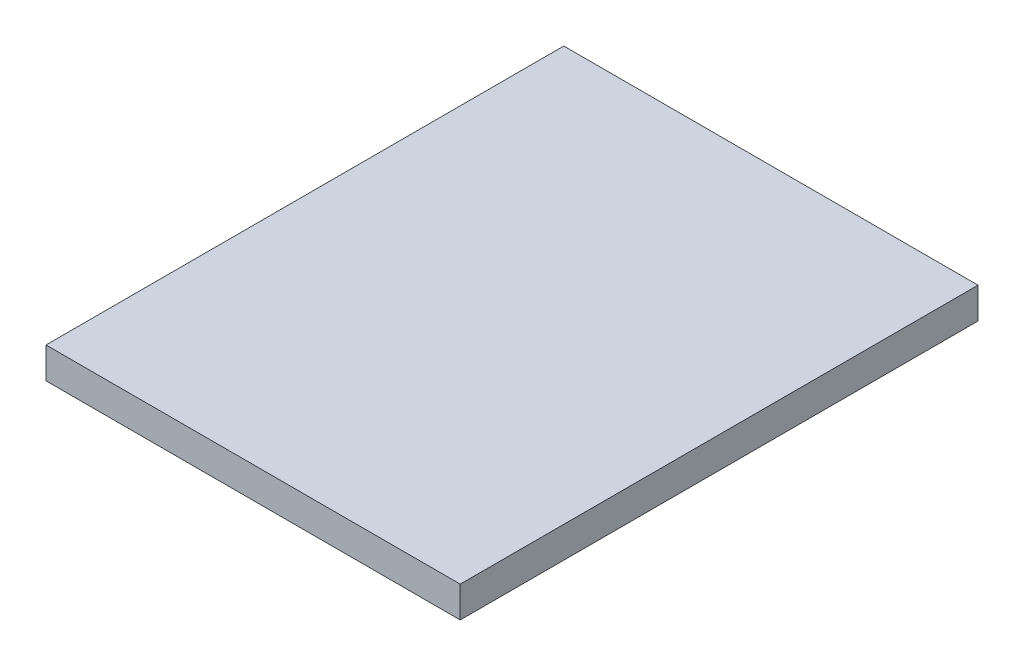
ISO-10303-21;
HEADER;
FILE_DESCRIPTION(('STEP AP214'),'2;1');
FILE_NAME('part.step','',(''),(''),'','','');
FILE_SCHEMA(('AUTOMOTIVE_DESIGN { 1 0 10303 214 1 1 1 1 }'));
ENDSEC;
DATA;
#1=APPLICATION_CONTEXT('core data for automotive mechanical design processes');
#2=APPLICATION_PROTOCOL_DEFINITION('international standard','automotive_design',2000,#1);
#3=PRODUCT_CONTEXT('',#1,'mechanical');
#4=PRODUCT('Part','Part','',(#3));
#5=PRODUCT_RELATED_PRODUCT_CATEGORY('part','',(#4));
#6=PRODUCT_DEFINITION_FORMATION('','',#4);
#7=PRODUCT_DEFINITION_CONTEXT('part definition',#1,'design');
#8=PRODUCT_DEFINITION('design','',#6,#7);
#9=PRODUCT_DEFINITION_SHAPE('','',#8);
#10=(LENGTH_UNIT() NAMED_UNIT(*) SI_UNIT(.MILLI.,.METRE.));
#11=(NAMED_UNIT(*) PLANE_ANGLE_UNIT() SI_UNIT($,.RADIAN.));
#12=(NAMED_UNIT(*) SI_UNIT($,.STERADIAN.) SOLID_ANGLE_UNIT());
#13=UNCERTAINTY_MEASURE_WITH_UNIT(LENGTH_MEASURE(1.E-05),#10,'distance_accuracy_value','');
#14=(GEOMETRIC_REPRESENTATION_CONTEXT(3) GLOBAL_UNCERTAINTY_ASSIGNED_CONTEXT((#13)) GLOBAL_UNIT_ASSIGNED_CONTEXT((#10,
#11,#12)) REPRESENTATION_CONTEXT('',''));
#15=CARTESIAN_POINT('',(0.,0.,0.));
#16=DIRECTION('',(0.,0.,1.));
#17=DIRECTION('',(1.,0.,0.));
#18=AXIS2_PLACEMENT_3D('',#15,#16,#17);
#19=CARTESIAN_POINT('',(0.,3.,0.));
#20=DIRECTION('',(1.,0.,0.));
#21=DIRECTION('',(0.,0.,-1.));
#22=AXIS2_PLACEMENT_3D('',#19,#20,#21);
#23=PLANE('',#22);
#24=DIRECTION('',(0.,0.,1.));
#25=VECTOR('',#24,1.);
#26=CARTESIAN_POINT('',(0.,0.,0.));
#27=LINE('',#26,#25);
#28=CARTESIAN_POINT('',(0.,0.,-50.));
#29=VERTEX_POINT('',#28);
#30=CARTESIAN_POINT('',(0.,0.,0.));
#31=VERTEX_POINT('',#30);
#32=EDGE_CURVE('E101',#29,#31,#27,.T.);
#33=ORIENTED_EDGE('',*,*,#32,.T.);
#34=DIRECTION('',(0.,-1.,0.));
#35=VECTOR('',#34,1.);
#36=CARTESIAN_POINT('',(0.,3.,0.));
#37=LINE('',#36,#35);
#38=CARTESIAN_POINT('',(0.,3.,0.));
#39=VERTEX_POINT('',#38);
#40=EDGE_CURVE('E11',#39,#31,#37,.T.);
#41=ORIENTED_EDGE('',*,*,#40,.F.);
#42=DIRECTION('',(0.,0.,1.));
#43=VECTOR('',#42,1.);
#44=CARTESIAN_POINT('',(0.,3.,0.));
#45=LINE('',#44,#43);
#46=CARTESIAN_POINT('',(0.,3.,-50.));
#47=VERTEX_POINT('',#46);
#48=EDGE_CURVE('E89',#47,#39,#45,.T.);
#49=ORIENTED_EDGE('',*,*,#48,.F.);
#50=DIRECTION('',(0.,-1.,0.));
#51=VECTOR('',#50,1.);
#52=CARTESIAN_POINT('',(0.,3.,-50.));
#53=LINE('',#52,#51);
#54=EDGE_CURVE('E97',#47,#29,#53,.T.);
#55=ORIENTED_EDGE('',*,*,#54,.T.);
#56=EDGE_LOOP('',(#33,#41,#49,#55));
#57=FACE_BOUND('',#56,.T.);
#58=ADVANCED_FACE('F38',(#57),#23,.F.);
#59=CARTESIAN_POINT('',(0.,3.,0.));
#60=DIRECTION('',(0.,0.,-1.));
#61=DIRECTION('',(-1.,0.,0.));
#62=AXIS2_PLACEMENT_3D('',#59,#60,#61);
#63=PLANE('',#62);
#64=DIRECTION('',(1.,0.,0.));
#65=VECTOR('',#64,1.);
#66=CARTESIAN_POINT('',(0.,0.,0.));
#67=LINE('',#66,#65);
#68=CARTESIAN_POINT('',(40.,0.,0.));
#69=VERTEX_POINT('',#68);
#70=EDGE_CURVE('E93',#31,#69,#67,.T.);
#71=ORIENTED_EDGE('',*,*,#70,.T.);
#72=DIRECTION('',(0.,-1.,0.));
#73=VECTOR('',#72,1.);
#74=CARTESIAN_POINT('',(40.,3.,0.));
#75=LINE('',#74,#73);
#76=CARTESIAN_POINT('',(40.,3.,0.));
#77=VERTEX_POINT('',#76);
#78=EDGE_CURVE('E46',#77,#69,#75,.T.);
#79=ORIENTED_EDGE('',*,*,#78,.F.);
#80=DIRECTION('',(1.,0.,0.));
#81=VECTOR('',#80,1.);
#82=CARTESIAN_POINT('',(0.,3.,0.));
#83=LINE('',#82,#81);
#84=EDGE_CURVE('E84',#39,#77,#83,.T.);
#85=ORIENTED_EDGE('',*,*,#84,.F.);
#86=ORIENTED_EDGE('',*,*,#40,.T.);
#87=EDGE_LOOP('',(#71,#79,#85,#86));
#88=FACE_BOUND('',#87,.T.);
#89=ADVANCED_FACE('F92',(#88),#63,.F.);
#90=CARTESIAN_POINT('',(40.,3.,0.));
#91=DIRECTION('',(-1.,0.,0.));
#92=DIRECTION('',(0.,0.,1.));
#93=AXIS2_PLACEMENT_3D('',#90,#91,#92);
#94=PLANE('',#93);
#95=DIRECTION('',(0.,0.,-1.));
#96=VECTOR('',#95,1.);
#97=CARTESIAN_POINT('',(40.,0.,0.));
#98=LINE('',#97,#96);
#99=CARTESIAN_POINT('',(40.,0.,-50.));
#100=VERTEX_POINT('',#99);
#101=EDGE_CURVE('E71',#69,#100,#98,.T.);
#102=ORIENTED_EDGE('',*,*,#101,.T.);
#103=DIRECTION('',(0.,-1.,0.));
#104=VECTOR('',#103,1.);
#105=CARTESIAN_POINT('',(40.,3.,-50.));
#106=LINE('',#105,#104);
#107=CARTESIAN_POINT('',(40.,3.,-50.));
#108=VERTEX_POINT('',#107);
#109=EDGE_CURVE('E94',#108,#100,#106,.T.);
#110=ORIENTED_EDGE('',*,*,#109,.F.);
#111=DIRECTION('',(0.,0.,-1.));
#112=VECTOR('',#111,1.);
#113=CARTESIAN_POINT('',(40.,3.,0.));
#114=LINE('',#113,#112);
#115=EDGE_CURVE('E87',#77,#108,#114,.T.);
#116=ORIENTED_EDGE('',*,*,#115,.F.);
#117=ORIENTED_EDGE('',*,*,#78,.T.);
#118=EDGE_LOOP('',(#102,#110,#116,#117));
#119=FACE_BOUND('',#118,.T.);
#120=ADVANCED_FACE('F95',(#119),#94,.F.);
#121=CARTESIAN_POINT('',(0.,3.,-50.));
#122=DIRECTION('',(0.,0.,1.));
#123=DIRECTION('',(1.,0.,0.));
#124=AXIS2_PLACEMENT_3D('',#121,#122,#123);
#125=PLANE('',#124);
#126=DIRECTION('',(-1.,0.,0.));
#127=VECTOR('',#126,1.);
#128=CARTESIAN_POINT('',(0.,0.,-50.));
#129=LINE('',#128,#127);
#130=EDGE_CURVE('E77',#100,#29,#129,.T.);
#131=ORIENTED_EDGE('',*,*,#130,.T.);
#132=ORIENTED_EDGE('',*,*,#54,.F.);
#133=DIRECTION('',(-1.,0.,0.));
#134=VECTOR('',#133,1.);
#135=CARTESIAN_POINT('',(0.,3.,-50.));
#136=LINE('',#135,#134);
#137=EDGE_CURVE('E54',#108,#47,#136,.T.);
#138=ORIENTED_EDGE('',*,*,#137,.F.);
#139=ORIENTED_EDGE('',*,*,#109,.T.);
#140=EDGE_LOOP('',(#131,#132,#138,#139));
#141=FACE_BOUND('',#140,.T.);
#142=ADVANCED_FACE('F108',(#141),#125,.F.);
#143=CARTESIAN_POINT('',(0.,3.,0.));
#144=DIRECTION('',(0.,-1.,0.));
#145=DIRECTION('',(0.,0.,-1.));
#146=AXIS2_PLACEMENT_3D('',#143,#144,#145);
#147=PLANE('',#146);
#148=ORIENTED_EDGE('',*,*,#48,.T.);
#149=ORIENTED_EDGE('',*,*,#84,.T.);
#150=ORIENTED_EDGE('',*,*,#115,.T.);
#151=ORIENTED_EDGE('',*,*,#137,.T.);
#152=EDGE_LOOP('',(#148,#149,#150,#151));
#153=FACE_BOUND('',#152,.T.);
#154=ADVANCED_FACE('F85',(#153),#147,.F.);
#155=CARTESIAN_POINT('',(0.,0.,0.));
#156=DIRECTION('',(0.,-1.,0.));
#157=DIRECTION('',(0.,0.,-1.));
#158=AXIS2_PLACEMENT_3D('',#155,#156,#157);
#159=PLANE('',#158);
#160=ORIENTED_EDGE('',*,*,#32,.F.);
#161=ORIENTED_EDGE('',*,*,#130,.F.);
#162=ORIENTED_EDGE('',*,*,#101,.F.);
#163=ORIENTED_EDGE('',*,*,#70,.F.);
#164=EDGE_LOOP('',(#160,#161,#162,#163));
#165=FACE_BOUND('',#164,.T.);
#166=ADVANCED_FACE('F111',(#165),#159,.T.);
#167=CLOSED_SHELL('',(#58,#89,#120,#142,#154,#166));
#168=MANIFOLD_SOLID_BREP('B2',#167);
#169=ADVANCED_BREP_SHAPE_REPRESENTATION('',(#18,#168),#14);
#170=SHAPE_DEFINITION_REPRESENTATION(#9,#169);
ENDSEC;
END-ISO-10303-21;
